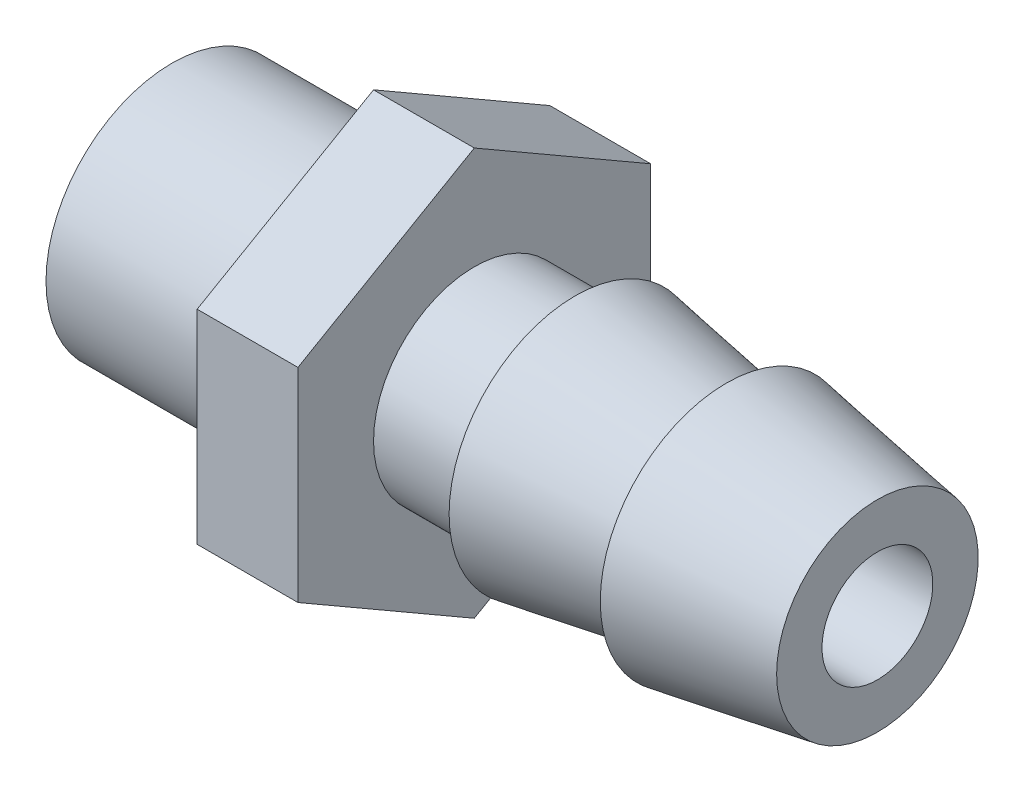
ISO-10303-21;
HEADER;
FILE_DESCRIPTION(('STEP AP214'),'2;1');
FILE_NAME('part.step','',(''),(''),'','','');
FILE_SCHEMA(('AUTOMOTIVE_DESIGN { 1 0 10303 214 1 1 1 1 }'));
ENDSEC;
DATA;
#1=APPLICATION_CONTEXT('core data for automotive mechanical design processes');
#2=APPLICATION_PROTOCOL_DEFINITION('international standard','automotive_design',2000,#1);
#3=PRODUCT_CONTEXT('',#1,'mechanical');
#4=PRODUCT('Part','Part','',(#3));
#5=PRODUCT_RELATED_PRODUCT_CATEGORY('part','',(#4));
#6=PRODUCT_DEFINITION_FORMATION('','',#4);
#7=PRODUCT_DEFINITION_CONTEXT('part definition',#1,'design');
#8=PRODUCT_DEFINITION('design','',#6,#7);
#9=PRODUCT_DEFINITION_SHAPE('','',#8);
#10=(LENGTH_UNIT() NAMED_UNIT(*) SI_UNIT(.MILLI.,.METRE.));
#11=(NAMED_UNIT(*) PLANE_ANGLE_UNIT() SI_UNIT($,.RADIAN.));
#12=(NAMED_UNIT(*) SI_UNIT($,.STERADIAN.) SOLID_ANGLE_UNIT());
#13=UNCERTAINTY_MEASURE_WITH_UNIT(LENGTH_MEASURE(1.E-05),#10,'distance_accuracy_value','');
#14=(GEOMETRIC_REPRESENTATION_CONTEXT(3) GLOBAL_UNCERTAINTY_ASSIGNED_CONTEXT((#13)) GLOBAL_UNIT_ASSIGNED_CONTEXT((#10,
#11,#12)) REPRESENTATION_CONTEXT('',''));
#15=CARTESIAN_POINT('',(0.,0.,0.));
#16=DIRECTION('',(0.,0.,1.));
#17=DIRECTION('',(1.,0.,0.));
#18=AXIS2_PLACEMENT_3D('',#15,#16,#17);
#19=CARTESIAN_POINT('',(0.,5.,0.));
#20=DIRECTION('',(1.,0.,0.));
#21=DIRECTION('',(0.,0.,-1.));
#22=AXIS2_PLACEMENT_3D('',#19,#20,#21);
#23=PLANE('',#22);
#24=CARTESIAN_POINT('',(0.,0.,0.));
#25=DIRECTION('',(-1.,0.,0.));
#26=DIRECTION('',(0.,0.,1.));
#27=AXIS2_PLACEMENT_3D('',#24,#25,#26);
#28=CIRCLE('',#27,2.5);
#29=CARTESIAN_POINT('',(0.,0.,2.5));
#30=VERTEX_POINT('',#29);
#31=EDGE_CURVE('E12',#30,#30,#28,.T.);
#32=ORIENTED_EDGE('',*,*,#31,.F.);
#33=EDGE_LOOP('',(#32));
#34=FACE_BOUND('',#33,.T.);
#35=DIRECTION('',(0.,-0.5,0.866025403784439));
#36=VECTOR('',#35,1.);
#37=CARTESIAN_POINT('',(0.,-4.04145188432738,0.));
#38=LINE('',#37,#36);
#39=CARTESIAN_POINT('',(0.,-2.02072594216369,-3.5));
#40=VERTEX_POINT('',#39);
#41=CARTESIAN_POINT('',(0.,-4.04145188432738,0.));
#42=VERTEX_POINT('',#41);
#43=EDGE_CURVE('E89',#40,#42,#38,.T.);
#44=ORIENTED_EDGE('',*,*,#43,.T.);
#45=DIRECTION('',(0.,0.5,0.866025403784439));
#46=VECTOR('',#45,1.);
#47=CARTESIAN_POINT('',(0.,-2.02072594216369,3.5));
#48=LINE('',#47,#46);
#49=CARTESIAN_POINT('',(0.,-2.02072594216369,3.5));
#50=VERTEX_POINT('',#49);
#51=EDGE_CURVE('E126',#42,#50,#48,.T.);
#52=ORIENTED_EDGE('',*,*,#51,.T.);
#53=DIRECTION('',(0.,1.,0.));
#54=VECTOR('',#53,1.);
#55=CARTESIAN_POINT('',(0.,2.02072594216369,3.5));
#56=LINE('',#55,#54);
#57=CARTESIAN_POINT('',(0.,2.02072594216369,3.5));
#58=VERTEX_POINT('',#57);
#59=EDGE_CURVE('E219',#50,#58,#56,.T.);
#60=ORIENTED_EDGE('',*,*,#59,.T.);
#61=DIRECTION('',(0.,0.5,-0.866025403784439));
#62=VECTOR('',#61,1.);
#63=CARTESIAN_POINT('',(0.,4.04145188432738,0.));
#64=LINE('',#63,#62);
#65=CARTESIAN_POINT('',(0.,4.04145188432738,0.));
#66=VERTEX_POINT('',#65);
#67=EDGE_CURVE('E215',#58,#66,#64,.T.);
#68=ORIENTED_EDGE('',*,*,#67,.T.);
#69=DIRECTION('',(0.,-0.5,-0.866025403784439));
#70=VECTOR('',#69,1.);
#71=CARTESIAN_POINT('',(0.,2.02072594216369,-3.5));
#72=LINE('',#71,#70);
#73=CARTESIAN_POINT('',(0.,2.02072594216369,-3.5));
#74=VERTEX_POINT('',#73);
#75=EDGE_CURVE('E213',#66,#74,#72,.T.);
#76=ORIENTED_EDGE('',*,*,#75,.T.);
#77=DIRECTION('',(0.,-1.,0.));
#78=VECTOR('',#77,1.);
#79=CARTESIAN_POINT('',(0.,-2.02072594216369,-3.5));
#80=LINE('',#79,#78);
#81=EDGE_CURVE('E131',#74,#40,#80,.T.);
#82=ORIENTED_EDGE('',*,*,#81,.T.);
#83=EDGE_LOOP('',(#44,#52,#60,#68,#76,#82));
#84=FACE_BOUND('',#83,.T.);
#85=ADVANCED_FACE('F33',(#34,#84),#23,.F.);
#86=CARTESIAN_POINT('',(2.,2.,0.));
#87=DIRECTION('',(-1.,0.,0.));
#88=DIRECTION('',(0.,0.,1.));
#89=AXIS2_PLACEMENT_3D('',#86,#87,#88);
#90=PLANE('',#89);
#91=CARTESIAN_POINT('',(2.,0.,0.));
#92=DIRECTION('',(-1.,0.,0.));
#93=DIRECTION('',(0.,0.,1.));
#94=AXIS2_PLACEMENT_3D('',#91,#92,#93);
#95=CIRCLE('',#94,2.);
#96=CARTESIAN_POINT('',(2.,0.,2.));
#97=VERTEX_POINT('',#96);
#98=EDGE_CURVE('E41',#97,#97,#95,.T.);
#99=ORIENTED_EDGE('',*,*,#98,.T.);
#100=EDGE_LOOP('',(#99));
#101=FACE_BOUND('',#100,.T.);
#102=DIRECTION('',(0.,0.5,-0.866025403784439));
#103=VECTOR('',#102,1.);
#104=CARTESIAN_POINT('',(2.,-4.04145188432738,0.));
#105=LINE('',#104,#103);
#106=CARTESIAN_POINT('',(2.,-4.04145188432738,0.));
#107=VERTEX_POINT('',#106);
#108=CARTESIAN_POINT('',(2.,-2.02072594216369,-3.5));
#109=VERTEX_POINT('',#108);
#110=EDGE_CURVE('E56',#107,#109,#105,.T.);
#111=ORIENTED_EDGE('',*,*,#110,.T.);
#112=DIRECTION('',(0.,1.,0.));
#113=VECTOR('',#112,1.);
#114=CARTESIAN_POINT('',(2.,-2.02072594216369,-3.5));
#115=LINE('',#114,#113);
#116=CARTESIAN_POINT('',(2.,2.02072594216369,-3.5));
#117=VERTEX_POINT('',#116);
#118=EDGE_CURVE('E96',#109,#117,#115,.T.);
#119=ORIENTED_EDGE('',*,*,#118,.T.);
#120=DIRECTION('',(0.,0.5,0.866025403784439));
#121=VECTOR('',#120,1.);
#122=CARTESIAN_POINT('',(2.,2.02072594216369,-3.5));
#123=LINE('',#122,#121);
#124=CARTESIAN_POINT('',(2.,4.04145188432738,0.));
#125=VERTEX_POINT('',#124);
#126=EDGE_CURVE('E102',#117,#125,#123,.T.);
#127=ORIENTED_EDGE('',*,*,#126,.T.);
#128=DIRECTION('',(0.,-0.5,0.866025403784439));
#129=VECTOR('',#128,1.);
#130=CARTESIAN_POINT('',(2.,4.04145188432738,0.));
#131=LINE('',#130,#129);
#132=CARTESIAN_POINT('',(2.,2.02072594216369,3.5));
#133=VERTEX_POINT('',#132);
#134=EDGE_CURVE('E113',#125,#133,#131,.T.);
#135=ORIENTED_EDGE('',*,*,#134,.T.);
#136=DIRECTION('',(0.,-1.,0.));
#137=VECTOR('',#136,1.);
#138=CARTESIAN_POINT('',(2.,2.02072594216369,3.5));
#139=LINE('',#138,#137);
#140=CARTESIAN_POINT('',(2.,-2.02072594216369,3.5));
#141=VERTEX_POINT('',#140);
#142=EDGE_CURVE('E116',#133,#141,#139,.T.);
#143=ORIENTED_EDGE('',*,*,#142,.T.);
#144=DIRECTION('',(0.,-0.5,-0.866025403784439));
#145=VECTOR('',#144,1.);
#146=CARTESIAN_POINT('',(2.,-2.02072594216369,3.5));
#147=LINE('',#146,#145);
#148=EDGE_CURVE('E107',#141,#107,#147,.T.);
#149=ORIENTED_EDGE('',*,*,#148,.T.);
#150=EDGE_LOOP('',(#111,#119,#127,#135,#143,#149));
#151=FACE_BOUND('',#150,.T.);
#152=ADVANCED_FACE('F105',(#101,#151),#90,.F.);
#153=CARTESIAN_POINT('',(0.,0.,0.));
#154=DIRECTION('',(-1.,0.,0.));
#155=DIRECTION('',(0.,0.,1.));
#156=AXIS2_PLACEMENT_3D('',#153,#154,#155);
#157=CYLINDRICAL_SURFACE('',#156,2.5);
#158=CARTESIAN_POINT('',(-4.,0.,0.));
#159=DIRECTION('',(-1.,0.,0.));
#160=DIRECTION('',(0.,0.,1.));
#161=AXIS2_PLACEMENT_3D('',#158,#159,#160);
#162=CIRCLE('',#161,2.5);
#163=CARTESIAN_POINT('',(-4.,0.,2.5));
#164=VERTEX_POINT('',#163);
#165=EDGE_CURVE('E127',#164,#164,#162,.T.);
#166=ORIENTED_EDGE('',*,*,#165,.F.);
#167=EDGE_LOOP('',(#166));
#168=FACE_BOUND('',#167,.T.);
#169=ORIENTED_EDGE('',*,*,#31,.T.);
#170=EDGE_LOOP('',(#169));
#171=FACE_BOUND('',#170,.T.);
#172=ADVANCED_FACE('F35',(#168,#171),#157,.T.);
#173=CARTESIAN_POINT('',(0.,0.,0.));
#174=DIRECTION('',(-1.,0.,0.));
#175=DIRECTION('',(0.,0.,1.));
#176=AXIS2_PLACEMENT_3D('',#173,#174,#175);
#177=CYLINDRICAL_SURFACE('',#176,2.);
#178=ORIENTED_EDGE('',*,*,#98,.F.);
#179=EDGE_LOOP('',(#178));
#180=FACE_BOUND('',#179,.T.);
#181=CARTESIAN_POINT('',(4.,0.,0.));
#182=DIRECTION('',(-1.,0.,0.));
#183=DIRECTION('',(0.,0.,1.));
#184=AXIS2_PLACEMENT_3D('',#181,#182,#183);
#185=CIRCLE('',#184,2.);
#186=CARTESIAN_POINT('',(4.,0.,2.));
#187=VERTEX_POINT('',#186);
#188=EDGE_CURVE('E149',#187,#187,#185,.T.);
#189=ORIENTED_EDGE('',*,*,#188,.T.);
#190=EDGE_LOOP('',(#189));
#191=FACE_BOUND('',#190,.T.);
#192=ADVANCED_FACE('F155',(#180,#191),#177,.T.);
#193=CARTESIAN_POINT('',(4.,2.5,0.));
#194=DIRECTION('',(1.,0.,0.));
#195=DIRECTION('',(0.,0.,-1.));
#196=AXIS2_PLACEMENT_3D('',#193,#194,#195);
#197=PLANE('',#196);
#198=ORIENTED_EDGE('',*,*,#188,.F.);
#199=EDGE_LOOP('',(#198));
#200=FACE_BOUND('',#199,.T.);
#201=CARTESIAN_POINT('',(4.,0.,0.));
#202=DIRECTION('',(-1.,0.,0.));
#203=DIRECTION('',(0.,0.,1.));
#204=AXIS2_PLACEMENT_3D('',#201,#202,#203);
#205=CIRCLE('',#204,2.5);
#206=CARTESIAN_POINT('',(4.,0.,2.5));
#207=VERTEX_POINT('',#206);
#208=EDGE_CURVE('E146',#207,#207,#205,.T.);
#209=ORIENTED_EDGE('',*,*,#208,.T.);
#210=EDGE_LOOP('',(#209));
#211=FACE_BOUND('',#210,.T.);
#212=ADVANCED_FACE('F158',(#200,#211),#197,.F.);
#213=CARTESIAN_POINT('',(7.,0.,0.));
#214=DIRECTION('',(-1.,0.,0.));
#215=DIRECTION('',(0.,0.,1.));
#216=AXIS2_PLACEMENT_3D('',#213,#214,#215);
#217=CONICAL_SURFACE('',#216,2.,0.165148677414627);
#218=ORIENTED_EDGE('',*,*,#208,.F.);
#219=EDGE_LOOP('',(#218));
#220=FACE_BOUND('',#219,.T.);
#221=CARTESIAN_POINT('',(7.,0.,0.));
#222=DIRECTION('',(-1.,0.,0.));
#223=DIRECTION('',(0.,0.,1.));
#224=AXIS2_PLACEMENT_3D('',#221,#222,#223);
#225=CIRCLE('',#224,2.);
#226=CARTESIAN_POINT('',(7.,0.,2.));
#227=VERTEX_POINT('',#226);
#228=EDGE_CURVE('E143',#227,#227,#225,.T.);
#229=ORIENTED_EDGE('',*,*,#228,.T.);
#230=EDGE_LOOP('',(#229));
#231=FACE_BOUND('',#230,.T.);
#232=ADVANCED_FACE('F164',(#220,#231),#217,.T.);
#233=CARTESIAN_POINT('',(7.,2.5,0.));
#234=DIRECTION('',(1.,0.,0.));
#235=DIRECTION('',(0.,0.,-1.));
#236=AXIS2_PLACEMENT_3D('',#233,#234,#235);
#237=PLANE('',#236);
#238=ORIENTED_EDGE('',*,*,#228,.F.);
#239=EDGE_LOOP('',(#238));
#240=FACE_BOUND('',#239,.T.);
#241=CARTESIAN_POINT('',(7.,0.,0.));
#242=DIRECTION('',(-1.,0.,0.));
#243=DIRECTION('',(0.,0.,1.));
#244=AXIS2_PLACEMENT_3D('',#241,#242,#243);
#245=CIRCLE('',#244,2.5);
#246=CARTESIAN_POINT('',(7.,0.,2.5));
#247=VERTEX_POINT('',#246);
#248=EDGE_CURVE('E140',#247,#247,#245,.T.);
#249=ORIENTED_EDGE('',*,*,#248,.T.);
#250=EDGE_LOOP('',(#249));
#251=FACE_BOUND('',#250,.T.);
#252=ADVANCED_FACE('F170',(#240,#251),#237,.F.);
#253=CARTESIAN_POINT('',(10.,0.,0.));
#254=DIRECTION('',(-1.,0.,0.));
#255=DIRECTION('',(0.,0.,1.));
#256=AXIS2_PLACEMENT_3D('',#253,#254,#255);
#257=CONICAL_SURFACE('',#256,2.,0.165148677414627);
#258=ORIENTED_EDGE('',*,*,#248,.F.);
#259=EDGE_LOOP('',(#258));
#260=FACE_BOUND('',#259,.T.);
#261=CARTESIAN_POINT('',(10.,0.,0.));
#262=DIRECTION('',(-1.,0.,0.));
#263=DIRECTION('',(0.,0.,1.));
#264=AXIS2_PLACEMENT_3D('',#261,#262,#263);
#265=CIRCLE('',#264,2.);
#266=CARTESIAN_POINT('',(10.,0.,2.));
#267=VERTEX_POINT('',#266);
#268=EDGE_CURVE('E137',#267,#267,#265,.T.);
#269=ORIENTED_EDGE('',*,*,#268,.T.);
#270=EDGE_LOOP('',(#269));
#271=FACE_BOUND('',#270,.T.);
#272=ADVANCED_FACE('F176',(#260,#271),#257,.T.);
#273=CARTESIAN_POINT('',(10.,1.1,0.));
#274=DIRECTION('',(-1.,0.,0.));
#275=DIRECTION('',(0.,0.,1.));
#276=AXIS2_PLACEMENT_3D('',#273,#274,#275);
#277=PLANE('',#276);
#278=ORIENTED_EDGE('',*,*,#268,.F.);
#279=EDGE_LOOP('',(#278));
#280=FACE_BOUND('',#279,.T.);
#281=CARTESIAN_POINT('',(10.,0.,0.));
#282=DIRECTION('',(-1.,0.,0.));
#283=DIRECTION('',(0.,0.,1.));
#284=AXIS2_PLACEMENT_3D('',#281,#282,#283);
#285=CIRCLE('',#284,1.1);
#286=CARTESIAN_POINT('',(10.,0.,1.1));
#287=VERTEX_POINT('',#286);
#288=EDGE_CURVE('E134',#287,#287,#285,.T.);
#289=ORIENTED_EDGE('',*,*,#288,.T.);
#290=EDGE_LOOP('',(#289));
#291=FACE_BOUND('',#290,.T.);
#292=ADVANCED_FACE('F182',(#280,#291),#277,.F.);
#293=CARTESIAN_POINT('',(0.,0.,0.));
#294=DIRECTION('',(-1.,0.,0.));
#295=DIRECTION('',(0.,0.,1.));
#296=AXIS2_PLACEMENT_3D('',#293,#294,#295);
#297=CYLINDRICAL_SURFACE('',#296,1.1);
#298=ORIENTED_EDGE('',*,*,#288,.F.);
#299=EDGE_LOOP('',(#298));
#300=FACE_BOUND('',#299,.T.);
#301=CARTESIAN_POINT('',(-4.,0.,0.));
#302=DIRECTION('',(-1.,0.,0.));
#303=DIRECTION('',(0.,0.,1.));
#304=AXIS2_PLACEMENT_3D('',#301,#302,#303);
#305=CIRCLE('',#304,1.1);
#306=CARTESIAN_POINT('',(-4.,0.,1.1));
#307=VERTEX_POINT('',#306);
#308=EDGE_CURVE('E130',#307,#307,#305,.T.);
#309=ORIENTED_EDGE('',*,*,#308,.T.);
#310=EDGE_LOOP('',(#309));
#311=FACE_BOUND('',#310,.T.);
#312=ADVANCED_FACE('F188',(#300,#311),#297,.F.);
#313=CARTESIAN_POINT('',(-4.,1.1,0.));
#314=DIRECTION('',(1.,0.,0.));
#315=DIRECTION('',(0.,0.,-1.));
#316=AXIS2_PLACEMENT_3D('',#313,#314,#315);
#317=PLANE('',#316);
#318=ORIENTED_EDGE('',*,*,#308,.F.);
#319=EDGE_LOOP('',(#318));
#320=FACE_BOUND('',#319,.T.);
#321=ORIENTED_EDGE('',*,*,#165,.T.);
#322=EDGE_LOOP('',(#321));
#323=FACE_BOUND('',#322,.T.);
#324=ADVANCED_FACE('F194',(#320,#323),#317,.F.);
#325=CARTESIAN_POINT('',(-14.2835569799683,-4.04145188432738,0.));
#326=DIRECTION('',(0.,-0.866025403784438,-0.5));
#327=DIRECTION('',(0.,0.5,-0.866025403784439));
#328=AXIS2_PLACEMENT_3D('',#325,#326,#327);
#329=PLANE('',#328);
#330=DIRECTION('',(1.,0.,0.));
#331=VECTOR('',#330,1.);
#332=CARTESIAN_POINT('',(-14.2835569799683,-2.02072594216369,-3.5));
#333=LINE('',#332,#331);
#334=EDGE_CURVE('E85',#40,#109,#333,.T.);
#335=ORIENTED_EDGE('',*,*,#334,.T.);
#336=ORIENTED_EDGE('',*,*,#110,.F.);
#337=DIRECTION('',(1.,0.,0.));
#338=VECTOR('',#337,1.);
#339=CARTESIAN_POINT('',(-14.2835569799683,-4.04145188432738,0.));
#340=LINE('',#339,#338);
#341=EDGE_CURVE('E93',#42,#107,#340,.T.);
#342=ORIENTED_EDGE('',*,*,#341,.F.);
#343=ORIENTED_EDGE('',*,*,#43,.F.);
#344=EDGE_LOOP('',(#335,#336,#342,#343));
#345=FACE_BOUND('',#344,.T.);
#346=ADVANCED_FACE('F87',(#345),#329,.T.);
#347=CARTESIAN_POINT('',(-14.2835569799683,-2.02072594216369,-3.5));
#348=DIRECTION('',(0.,0.,-1.));
#349=DIRECTION('',(-1.,0.,0.));
#350=AXIS2_PLACEMENT_3D('',#347,#348,#349);
#351=PLANE('',#350);
#352=DIRECTION('',(1.,0.,0.));
#353=VECTOR('',#352,1.);
#354=CARTESIAN_POINT('',(-14.2835569799683,2.02072594216369,-3.5));
#355=LINE('',#354,#353);
#356=EDGE_CURVE('E92',#74,#117,#355,.T.);
#357=ORIENTED_EDGE('',*,*,#356,.T.);
#358=ORIENTED_EDGE('',*,*,#118,.F.);
#359=ORIENTED_EDGE('',*,*,#334,.F.);
#360=ORIENTED_EDGE('',*,*,#81,.F.);
#361=EDGE_LOOP('',(#357,#358,#359,#360));
#362=FACE_BOUND('',#361,.T.);
#363=ADVANCED_FACE('F97',(#362),#351,.T.);
#364=CARTESIAN_POINT('',(-14.2835569799683,2.02072594216369,-3.5));
#365=DIRECTION('',(0.,0.866025403784439,-0.5));
#366=DIRECTION('',(0.,0.5,0.866025403784439));
#367=AXIS2_PLACEMENT_3D('',#364,#365,#366);
#368=PLANE('',#367);
#369=DIRECTION('',(1.,0.,0.));
#370=VECTOR('',#369,1.);
#371=CARTESIAN_POINT('',(-14.2835569799683,4.04145188432738,0.));
#372=LINE('',#371,#370);
#373=EDGE_CURVE('E121',#66,#125,#372,.T.);
#374=ORIENTED_EDGE('',*,*,#373,.T.);
#375=ORIENTED_EDGE('',*,*,#126,.F.);
#376=ORIENTED_EDGE('',*,*,#356,.F.);
#377=ORIENTED_EDGE('',*,*,#75,.F.);
#378=EDGE_LOOP('',(#374,#375,#376,#377));
#379=FACE_BOUND('',#378,.T.);
#380=ADVANCED_FACE('F229',(#379),#368,.T.);
#381=CARTESIAN_POINT('',(-14.2835569799683,4.04145188432738,0.));
#382=DIRECTION('',(0.,0.866025403784439,0.5));
#383=DIRECTION('',(0.,-0.5,0.866025403784439));
#384=AXIS2_PLACEMENT_3D('',#381,#382,#383);
#385=PLANE('',#384);
#386=DIRECTION('',(1.,0.,0.));
#387=VECTOR('',#386,1.);
#388=CARTESIAN_POINT('',(-14.2835569799683,2.02072594216369,3.5));
#389=LINE('',#388,#387);
#390=EDGE_CURVE('E119',#58,#133,#389,.T.);
#391=ORIENTED_EDGE('',*,*,#390,.T.);
#392=ORIENTED_EDGE('',*,*,#134,.F.);
#393=ORIENTED_EDGE('',*,*,#373,.F.);
#394=ORIENTED_EDGE('',*,*,#67,.F.);
#395=EDGE_LOOP('',(#391,#392,#393,#394));
#396=FACE_BOUND('',#395,.T.);
#397=ADVANCED_FACE('F226',(#396),#385,.T.);
#398=CARTESIAN_POINT('',(-14.2835569799683,2.02072594216369,3.5));
#399=DIRECTION('',(0.,0.,1.));
#400=DIRECTION('',(0.,-1.,0.));
#401=AXIS2_PLACEMENT_3D('',#398,#399,#400);
#402=PLANE('',#401);
#403=DIRECTION('',(1.,0.,0.));
#404=VECTOR('',#403,1.);
#405=CARTESIAN_POINT('',(-14.2835569799683,-2.02072594216369,3.5));
#406=LINE('',#405,#404);
#407=EDGE_CURVE('E48',#50,#141,#406,.T.);
#408=ORIENTED_EDGE('',*,*,#407,.T.);
#409=ORIENTED_EDGE('',*,*,#142,.F.);
#410=ORIENTED_EDGE('',*,*,#390,.F.);
#411=ORIENTED_EDGE('',*,*,#59,.F.);
#412=EDGE_LOOP('',(#408,#409,#410,#411));
#413=FACE_BOUND('',#412,.T.);
#414=ADVANCED_FACE('F222',(#413),#402,.T.);
#415=CARTESIAN_POINT('',(-14.2835569799683,-2.02072594216369,3.5));
#416=DIRECTION('',(0.,-0.866025403784439,0.5));
#417=DIRECTION('',(0.,-0.5,-0.866025403784439));
#418=AXIS2_PLACEMENT_3D('',#415,#416,#417);
#419=PLANE('',#418);
#420=ORIENTED_EDGE('',*,*,#341,.T.);
#421=ORIENTED_EDGE('',*,*,#148,.F.);
#422=ORIENTED_EDGE('',*,*,#407,.F.);
#423=ORIENTED_EDGE('',*,*,#51,.F.);
#424=EDGE_LOOP('',(#420,#421,#422,#423));
#425=FACE_BOUND('',#424,.T.);
#426=ADVANCED_FACE('F242',(#425),#419,.T.);
#427=CLOSED_SHELL('',(#85,#152,#172,#192,#212,#232,#252,#272,#292,#312,#324,#346,#363,#380,#397,
#414,#426));
#428=MANIFOLD_SOLID_BREP('B2',#427);
#429=ADVANCED_BREP_SHAPE_REPRESENTATION('',(#18,#428),#14);
#430=SHAPE_DEFINITION_REPRESENTATION(#9,#429);
ENDSEC;
END-ISO-10303-21;
